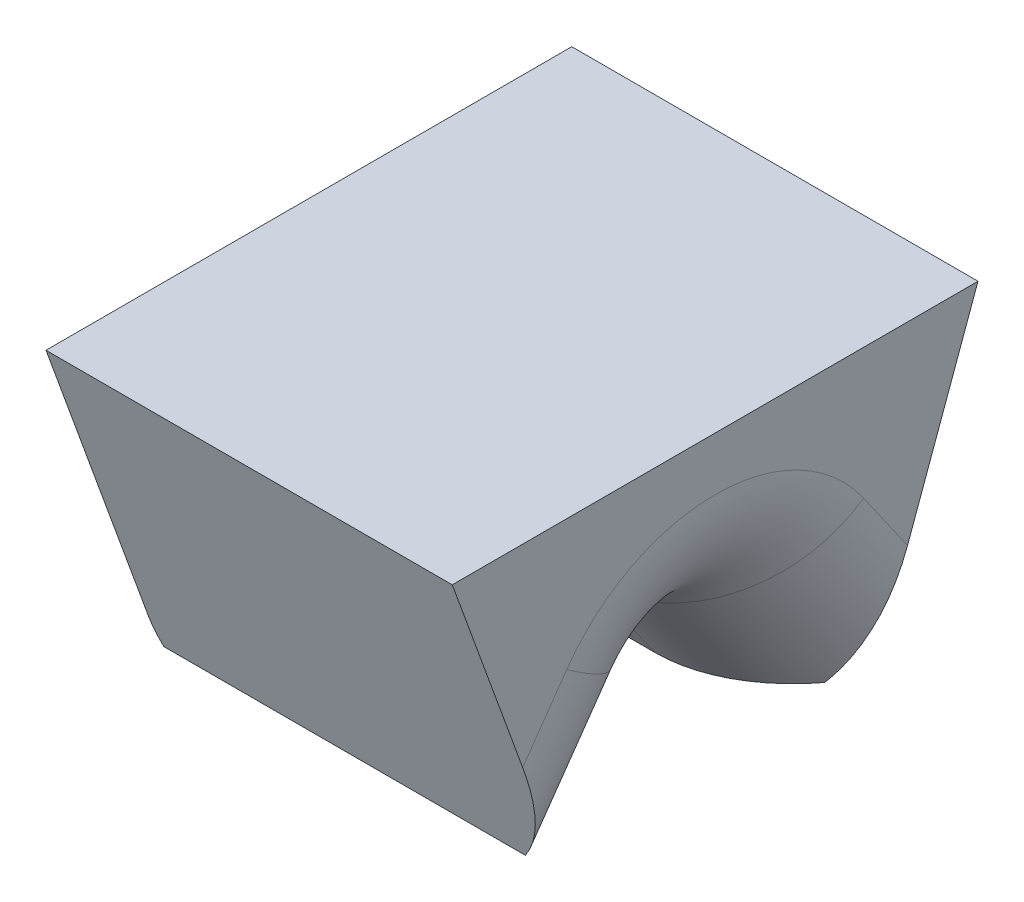
ISO-10303-21;
HEADER;
FILE_DESCRIPTION(('STEP AP214'),'2;1');
FILE_NAME('part.step','',(''),(''),'','','');
FILE_SCHEMA(('AUTOMOTIVE_DESIGN { 1 0 10303 214 1 1 1 1 }'));
ENDSEC;
DATA;
#1=APPLICATION_CONTEXT('core data for automotive mechanical design processes');
#2=APPLICATION_PROTOCOL_DEFINITION('international standard','automotive_design',2000,#1);
#3=PRODUCT_CONTEXT('',#1,'mechanical');
#4=PRODUCT('Part','Part','',(#3));
#5=PRODUCT_RELATED_PRODUCT_CATEGORY('part','',(#4));
#6=PRODUCT_DEFINITION_FORMATION('','',#4);
#7=PRODUCT_DEFINITION_CONTEXT('part definition',#1,'design');
#8=PRODUCT_DEFINITION('design','',#6,#7);
#9=PRODUCT_DEFINITION_SHAPE('','',#8);
#10=(LENGTH_UNIT() NAMED_UNIT(*) SI_UNIT(.MILLI.,.METRE.));
#11=(NAMED_UNIT(*) PLANE_ANGLE_UNIT() SI_UNIT($,.RADIAN.));
#12=(NAMED_UNIT(*) SI_UNIT($,.STERADIAN.) SOLID_ANGLE_UNIT());
#13=UNCERTAINTY_MEASURE_WITH_UNIT(LENGTH_MEASURE(1.E-05),#10,'distance_accuracy_value','');
#14=(GEOMETRIC_REPRESENTATION_CONTEXT(3) GLOBAL_UNCERTAINTY_ASSIGNED_CONTEXT((#13)) GLOBAL_UNIT_ASSIGNED_CONTEXT((#10,
#11,#12)) REPRESENTATION_CONTEXT('',''));
#15=CARTESIAN_POINT('',(0.,0.,0.));
#16=DIRECTION('',(0.,0.,1.));
#17=DIRECTION('',(1.,0.,0.));
#18=AXIS2_PLACEMENT_3D('',#15,#16,#17);
#19=CARTESIAN_POINT('',(0.,0.414017929910338,0.));
#20=DIRECTION('',(0.,1.,0.));
#21=DIRECTION('',(0.,0.,1.));
#22=AXIS2_PLACEMENT_3D('',#19,#20,#21);
#23=PLANE('',#22);
#24=DIRECTION('',(0.,0.,-1.));
#25=VECTOR('',#24,1.);
#26=CARTESIAN_POINT('',(0.50673,0.414017929910338,2.00770998));
#27=LINE('',#26,#25);
#28=CARTESIAN_POINT('',(0.506730000000001,0.414017929910338,0.350080202939874));
#29=VERTEX_POINT('',#28);
#30=CARTESIAN_POINT('',(0.506730000000001,0.414017929910338,-0.350080202939874));
#31=VERTEX_POINT('',#30);
#32=EDGE_CURVE('E317',#29,#31,#27,.T.);
#33=ORIENTED_EDGE('',*,*,#32,.F.);
#34=DIRECTION('',(-1.,0.,0.));
#35=VECTOR('',#34,1.);
#36=CARTESIAN_POINT('',(2.00770998,0.414017929910338,0.350080202939874));
#37=LINE('',#36,#35);
#38=CARTESIAN_POINT('',(1.04775,0.414017929910338,0.350080202939874));
#39=VERTEX_POINT('',#38);
#40=EDGE_CURVE('E57',#39,#29,#37,.T.);
#41=ORIENTED_EDGE('',*,*,#40,.F.);
#42=DIRECTION('',(0.,0.,1.));
#43=VECTOR('',#42,1.);
#44=CARTESIAN_POINT('',(1.04775,0.414017929910338,2.00770998));
#45=LINE('',#44,#43);
#46=CARTESIAN_POINT('',(1.04775,0.414017929910338,-0.350080202939874));
#47=VERTEX_POINT('',#46);
#48=EDGE_CURVE('E12',#47,#39,#45,.T.);
#49=ORIENTED_EDGE('',*,*,#48,.F.);
#50=DIRECTION('',(1.,0.,0.));
#51=VECTOR('',#50,1.);
#52=CARTESIAN_POINT('',(2.00770998,0.414017929910338,-0.350080202939874));
#53=LINE('',#52,#51);
#54=EDGE_CURVE('E129',#31,#47,#53,.T.);
#55=ORIENTED_EDGE('',*,*,#54,.F.);
#56=EDGE_LOOP('',(#33,#41,#49,#55));
#57=FACE_BOUND('',#56,.T.);
#58=ADVANCED_FACE('F42',(#57),#23,.T.);
#59=CARTESIAN_POINT('',(2.00770998,0.,0.19939));
#60=DIRECTION('',(0.,-0.342020143325669,0.939692620785908));
#61=DIRECTION('',(0.,-0.939692620785908,-0.342020143325669));
#62=AXIS2_PLACEMENT_3D('',#59,#60,#61);
#63=PLANE('',#62);
#64=DIRECTION('',(0.,0.939692620785908,0.342020143325669));
#65=VECTOR('',#64,1.);
#66=CARTESIAN_POINT('',(1.04775,0.,0.19939));
#67=LINE('',#66,#65);
#68=CARTESIAN_POINT('',(1.04775,0.156293429962624,0.256276156317765));
#69=VERTEX_POINT('',#68);
#70=EDGE_CURVE('E147',#69,#39,#67,.T.);
#71=ORIENTED_EDGE('',*,*,#70,.T.);
#72=ORIENTED_EDGE('',*,*,#40,.T.);
#73=DIRECTION('',(0.,-0.939692620785908,-0.342020143325669));
#74=VECTOR('',#73,1.);
#75=CARTESIAN_POINT('',(0.50673,0.,0.19939));
#76=LINE('',#75,#74);
#77=CARTESIAN_POINT('',(0.50673,0.0397426980960916,0.213855159136405));
#78=VERTEX_POINT('',#77);
#79=EDGE_CURVE('E161',#29,#78,#76,.T.);
#80=ORIENTED_EDGE('',*,*,#79,.T.);
#81=CARTESIAN_POINT('',(0.60579,0.0397426980960916,0.213855159136405));
#82=DIRECTION('',(0.,-0.342020143325669,0.939692620785908));
#83=DIRECTION('',(0.,-0.939692620785908,-0.342020143325669));
#84=AXIS2_PLACEMENT_3D('',#81,#82,#83);
#85=ELLIPSE('',#84,0.12092993076271,0.09906);
#86=CARTESIAN_POINT('',(0.512985729992794,0.,0.19939));
#87=VERTEX_POINT('',#86);
#88=EDGE_CURVE('E258',#78,#87,#85,.T.);
#89=ORIENTED_EDGE('',*,*,#88,.T.);
#90=DIRECTION('',(-1.,0.,0.));
#91=VECTOR('',#90,1.);
#92=CARTESIAN_POINT('',(2.00770998,0.,0.19939));
#93=LINE('',#92,#91);
#94=CARTESIAN_POINT('',(0.994405422545101,0.,0.19939));
#95=VERTEX_POINT('',#94);
#96=EDGE_CURVE('E163',#95,#87,#93,.T.);
#97=ORIENTED_EDGE('',*,*,#96,.F.);
#98=CARTESIAN_POINT('',(0.84709,0.156293429962624,0.256276156317765));
#99=DIRECTION('',(0.,-0.342020143325669,0.939692620785908));
#100=DIRECTION('',(0.,0.939692620785908,0.342020143325669));
#101=AXIS2_PLACEMENT_3D('',#98,#99,#100);
#102=ELLIPSE('',#101,0.244960628980874,0.20066);
#103=EDGE_CURVE('E311',#95,#69,#102,.T.);
#104=ORIENTED_EDGE('',*,*,#103,.T.);
#105=EDGE_LOOP('',(#71,#72,#80,#89,#97,#104));
#106=FACE_BOUND('',#105,.T.);
#107=ADVANCED_FACE('F214',(#106),#63,.T.);
#108=CARTESIAN_POINT('',(2.00770998,0.,-0.19939));
#109=DIRECTION('',(0.,-0.342020143325669,-0.939692620785908));
#110=DIRECTION('',(0.,0.939692620785908,-0.342020143325669));
#111=AXIS2_PLACEMENT_3D('',#108,#109,#110);
#112=PLANE('',#111);
#113=DIRECTION('',(0.,0.939692620785908,-0.342020143325669));
#114=VECTOR('',#113,1.);
#115=CARTESIAN_POINT('',(0.50673,0.,-0.19939));
#116=LINE('',#115,#114);
#117=CARTESIAN_POINT('',(0.50673,0.0397426980960916,-0.213855159136405));
#118=VERTEX_POINT('',#117);
#119=EDGE_CURVE('E141',#118,#31,#116,.T.);
#120=ORIENTED_EDGE('',*,*,#119,.T.);
#121=ORIENTED_EDGE('',*,*,#54,.T.);
#122=DIRECTION('',(0.,-0.939692620785908,0.342020143325669));
#123=VECTOR('',#122,1.);
#124=CARTESIAN_POINT('',(1.04775,0.,-0.19939));
#125=LINE('',#124,#123);
#126=CARTESIAN_POINT('',(1.04775,0.156293429962624,-0.256276156317765));
#127=VERTEX_POINT('',#126);
#128=EDGE_CURVE('E138',#47,#127,#125,.T.);
#129=ORIENTED_EDGE('',*,*,#128,.T.);
#130=CARTESIAN_POINT('',(0.84709,0.156293429962624,-0.256276156317765));
#131=DIRECTION('',(0.,-0.342020143325669,-0.939692620785908));
#132=DIRECTION('',(0.,-0.939692620785908,0.342020143325669));
#133=AXIS2_PLACEMENT_3D('',#130,#131,#132);
#134=ELLIPSE('',#133,0.244960628980874,0.20066);
#135=CARTESIAN_POINT('',(0.994405422545101,0.,-0.19939));
#136=VERTEX_POINT('',#135);
#137=EDGE_CURVE('E300',#127,#136,#134,.T.);
#138=ORIENTED_EDGE('',*,*,#137,.T.);
#139=DIRECTION('',(-1.,0.,0.));
#140=VECTOR('',#139,1.);
#141=CARTESIAN_POINT('',(2.00770998,0.,-0.19939));
#142=LINE('',#141,#140);
#143=CARTESIAN_POINT('',(0.512985729992795,0.,-0.19939));
#144=VERTEX_POINT('',#143);
#145=EDGE_CURVE('E165',#136,#144,#142,.T.);
#146=ORIENTED_EDGE('',*,*,#145,.T.);
#147=CARTESIAN_POINT('',(0.60579,0.0397426980960917,-0.213855159136405));
#148=DIRECTION('',(0.,-0.342020143325669,-0.939692620785908));
#149=DIRECTION('',(0.,0.939692620785908,-0.342020143325669));
#150=AXIS2_PLACEMENT_3D('',#147,#148,#149);
#151=ELLIPSE('',#150,0.12092993076271,0.09906);
#152=EDGE_CURVE('E275',#144,#118,#151,.T.);
#153=ORIENTED_EDGE('',*,*,#152,.T.);
#154=EDGE_LOOP('',(#120,#121,#129,#138,#146,#153));
#155=FACE_BOUND('',#154,.T.);
#156=ADVANCED_FACE('F137',(#155),#112,.T.);
#157=CARTESIAN_POINT('',(0.50673,0.77994002,2.00770998));
#158=DIRECTION('',(-1.,0.,0.));
#159=DIRECTION('',(0.,-1.,0.));
#160=AXIS2_PLACEMENT_3D('',#157,#158,#159);
#161=PLANE('',#160);
#162=ORIENTED_EDGE('',*,*,#79,.F.);
#163=ORIENTED_EDGE('',*,*,#32,.T.);
#164=ORIENTED_EDGE('',*,*,#119,.F.);
#165=DIRECTION('',(0.,-0.819152044288992,-0.573576436351045));
#166=VECTOR('',#165,1.);
#167=CARTESIAN_POINT('',(0.50673,0.181728628158241,-0.114435540587172));
#168=LINE('',#167,#166);
#169=CARTESIAN_POINT('',(0.50673,0.181728628158241,-0.114435540587172));
#170=VERTEX_POINT('',#169);
#171=EDGE_CURVE('E248',#118,#170,#168,.F.);
#172=ORIENTED_EDGE('',*,*,#171,.T.);
#173=CARTESIAN_POINT('',(0.50673,0.1016,0.));
#174=DIRECTION('',(-1.,0.,0.));
#175=DIRECTION('',(0.,-1.,0.));
#176=AXIS2_PLACEMENT_3D('',#173,#174,#175);
#177=CIRCLE('',#176,0.1397);
#178=CARTESIAN_POINT('',(0.50673,0.181728628158241,0.114435540587172));
#179=VERTEX_POINT('',#178);
#180=EDGE_CURVE('E253',#170,#179,#177,.F.);
#181=ORIENTED_EDGE('',*,*,#180,.T.);
#182=DIRECTION('',(0.,0.819152044288993,-0.573576436351045));
#183=VECTOR('',#182,1.);
#184=CARTESIAN_POINT('',(0.50673,0.0568184817849346,0.201898566676639));
#185=LINE('',#184,#183);
#186=EDGE_CURVE('E255',#179,#78,#185,.F.);
#187=ORIENTED_EDGE('',*,*,#186,.T.);
#188=EDGE_LOOP('',(#162,#163,#164,#172,#181,#187));
#189=FACE_BOUND('',#188,.T.);
#190=ADVANCED_FACE('F338',(#189),#161,.T.);
#191=CARTESIAN_POINT('',(1.04775,-0.00999998,2.00770998));
#192=DIRECTION('',(1.,0.,0.));
#193=DIRECTION('',(0.,0.,-1.));
#194=AXIS2_PLACEMENT_3D('',#191,#192,#193);
#195=PLANE('',#194);
#196=ORIENTED_EDGE('',*,*,#128,.F.);
#197=ORIENTED_EDGE('',*,*,#48,.T.);
#198=ORIENTED_EDGE('',*,*,#70,.F.);
#199=DIRECTION('',(0.,-0.819152044288993,0.573576436351045));
#200=VECTOR('',#199,1.);
#201=CARTESIAN_POINT('',(1.04775,0.240003994091507,0.197661388286934));
#202=LINE('',#201,#200);
#203=CARTESIAN_POINT('',(1.04775,0.240003994091507,0.197661388286934));
#204=VERTEX_POINT('',#203);
#205=EDGE_CURVE('E297',#69,#204,#202,.F.);
#206=ORIENTED_EDGE('',*,*,#205,.T.);
#207=CARTESIAN_POINT('',(1.04775,0.1016,0.));
#208=DIRECTION('',(1.,0.,0.));
#209=DIRECTION('',(0.,0.,-1.));
#210=AXIS2_PLACEMENT_3D('',#207,#208,#209);
#211=CIRCLE('',#210,0.2413);
#212=CARTESIAN_POINT('',(1.04775,0.240003994091507,-0.197661388286934));
#213=VERTEX_POINT('',#212);
#214=EDGE_CURVE('E293',#204,#213,#211,.F.);
#215=ORIENTED_EDGE('',*,*,#214,.T.);
#216=DIRECTION('',(0.,0.819152044288992,0.573576436351045));
#217=VECTOR('',#216,1.);
#218=CARTESIAN_POINT('',(1.04775,0.115093847718201,-0.285124414376401));
#219=LINE('',#218,#217);
#220=EDGE_CURVE('E145',#213,#127,#219,.F.);
#221=ORIENTED_EDGE('',*,*,#220,.T.);
#222=EDGE_LOOP('',(#196,#197,#198,#206,#215,#221));
#223=FACE_BOUND('',#222,.T.);
#224=ADVANCED_FACE('F143',(#223),#195,.T.);
#225=CARTESIAN_POINT('',(0.,0.,0.));
#226=DIRECTION('',(0.,1.,0.));
#227=DIRECTION('',(0.,0.,1.));
#228=AXIS2_PLACEMENT_3D('',#225,#226,#227);
#229=PLANE('',#228);
#230=ORIENTED_EDGE('',*,*,#145,.F.);
#231=CARTESIAN_POINT('',(0.84709,0.,-0.365713994150245));
#232=DIRECTION('',(0.,1.,0.));
#233=DIRECTION('',(0.,0.,-1.));
#234=AXIS2_PLACEMENT_3D('',#231,#232,#233);
#235=ELLIPSE('',#234,0.244960628980874,0.20066);
#236=CARTESIAN_POINT('',(0.84709,0.,-0.120753365169372));
#237=VERTEX_POINT('',#236);
#238=EDGE_CURVE('E302',#136,#237,#235,.F.);
#239=ORIENTED_EDGE('',*,*,#238,.T.);
#240=CARTESIAN_POINT('',(0.84709,0.,-0.120753365169372));
#241=DIRECTION('',(-1.,0.,0.));
#242=VECTOR('',#241,1.);
#243=LINE('',#240,#242);
#244=CARTESIAN_POINT('',(0.60579,0.,-0.120753365169372));
#245=VERTEX_POINT('',#244);
#246=EDGE_CURVE('E249',#237,#245,#243,.T.);
#247=ORIENTED_EDGE('',*,*,#246,.T.);
#248=CARTESIAN_POINT('',(0.60579,0.,-0.241683295932081));
#249=DIRECTION('',(0.,1.,0.));
#250=DIRECTION('',(0.,0.,1.));
#251=AXIS2_PLACEMENT_3D('',#248,#249,#250);
#252=ELLIPSE('',#251,0.12092993076271,0.09906);
#253=EDGE_CURVE('E270',#245,#144,#252,.F.);
#254=ORIENTED_EDGE('',*,*,#253,.T.);
#255=EDGE_LOOP('',(#230,#239,#247,#254));
#256=FACE_BOUND('',#255,.T.);
#257=ADVANCED_FACE('F186',(#256),#229,.F.);
#258=CARTESIAN_POINT('',(0.60579,0.,0.120753365169372));
#259=DIRECTION('',(1.,0.,0.));
#260=VECTOR('',#259,1.);
#261=LINE('',#258,#260);
#262=CARTESIAN_POINT('',(0.60579,0.,0.120753365169372));
#263=VERTEX_POINT('',#262);
#264=CARTESIAN_POINT('',(0.84709,0.,0.120753365169372));
#265=VERTEX_POINT('',#264);
#266=EDGE_CURVE('E167',#263,#265,#261,.T.);
#267=ORIENTED_EDGE('',*,*,#266,.T.);
#268=CARTESIAN_POINT('',(0.84709,0.,0.365713994150245));
#269=DIRECTION('',(0.,1.,0.));
#270=DIRECTION('',(0.,0.,-1.));
#271=AXIS2_PLACEMENT_3D('',#268,#269,#270);
#272=ELLIPSE('',#271,0.244960628980874,0.20066);
#273=EDGE_CURVE('E64',#265,#95,#272,.F.);
#274=ORIENTED_EDGE('',*,*,#273,.T.);
#275=ORIENTED_EDGE('',*,*,#96,.T.);
#276=CARTESIAN_POINT('',(0.60579,0.,0.241683295932081));
#277=DIRECTION('',(0.,1.,0.));
#278=DIRECTION('',(0.,0.,1.));
#279=AXIS2_PLACEMENT_3D('',#276,#277,#278);
#280=ELLIPSE('',#279,0.12092993076271,0.09906);
#281=EDGE_CURVE('E261',#87,#263,#280,.F.);
#282=ORIENTED_EDGE('',*,*,#281,.T.);
#283=EDGE_LOOP('',(#267,#274,#275,#282));
#284=FACE_BOUND('',#283,.T.);
#285=ADVANCED_FACE('F175',(#284),#229,.F.);
#286=CARTESIAN_POINT('',(-1.60147,0.124910146373306,-0.0332903390799046));
#287=DIRECTION('',(0.,0.573576436351045,-0.819152044288992));
#288=DIRECTION('',(0.,0.819152044288992,0.573576436351045));
#289=AXIS2_PLACEMENT_3D('',#286,#287,#288);
#290=PLANE('',#289);
#291=ORIENTED_EDGE('',*,*,#246,.F.);
#292=DIRECTION('',(0.,0.819152044288992,0.573576436351045));
#293=VECTOR('',#292,1.);
#294=CARTESIAN_POINT('',(0.84709,0.124910146373306,-0.0332903390799046));
#295=LINE('',#294,#293);
#296=CARTESIAN_POINT('',(0.84709,0.124910146373306,-0.0332903390799046));
#297=VERTEX_POINT('',#296);
#298=EDGE_CURVE('E279',#237,#297,#295,.T.);
#299=ORIENTED_EDGE('',*,*,#298,.T.);
#300=DIRECTION('',(1.,0.,0.));
#301=VECTOR('',#300,1.);
#302=CARTESIAN_POINT('',(-1.60147,0.124910146373306,-0.0332903390799046));
#303=LINE('',#302,#301);
#304=CARTESIAN_POINT('',(0.60579,0.124910146373306,-0.0332903390799046));
#305=VERTEX_POINT('',#304);
#306=EDGE_CURVE('E152',#305,#297,#303,.T.);
#307=ORIENTED_EDGE('',*,*,#306,.F.);
#308=DIRECTION('',(0.,-0.819152044288992,-0.573576436351045));
#309=VECTOR('',#308,1.);
#310=CARTESIAN_POINT('',(0.60579,0.,-0.120753365169372));
#311=LINE('',#310,#309);
#312=EDGE_CURVE('E267',#305,#245,#311,.T.);
#313=ORIENTED_EDGE('',*,*,#312,.T.);
#314=EDGE_LOOP('',(#291,#299,#307,#313));
#315=FACE_BOUND('',#314,.T.);
#316=ADVANCED_FACE('F185',(#315),#290,.F.);
#317=CARTESIAN_POINT('',(-1.60147,-0.00999998000000012,0.127755426547318));
#318=DIRECTION('',(0.,0.573576436351045,0.819152044288992));
#319=DIRECTION('',(0.,-0.819152044288993,0.573576436351045));
#320=AXIS2_PLACEMENT_3D('',#317,#318,#319);
#321=PLANE('',#320);
#322=DIRECTION('',(1.,0.,0.));
#323=VECTOR('',#322,1.);
#324=CARTESIAN_POINT('',(-1.60147,0.124910146373306,0.0332903390799046));
#325=LINE('',#324,#323);
#326=CARTESIAN_POINT('',(0.60579,0.124910146373306,0.0332903390799046));
#327=VERTEX_POINT('',#326);
#328=CARTESIAN_POINT('',(0.84709,0.124910146373306,0.0332903390799046));
#329=VERTEX_POINT('',#328);
#330=EDGE_CURVE('E148',#327,#329,#325,.T.);
#331=ORIENTED_EDGE('',*,*,#330,.T.);
#332=DIRECTION('',(0.,-0.819152044288993,0.573576436351045));
#333=VECTOR('',#332,1.);
#334=CARTESIAN_POINT('',(0.84709,0.,0.120753365169372));
#335=LINE('',#334,#333);
#336=EDGE_CURVE('E304',#329,#265,#335,.T.);
#337=ORIENTED_EDGE('',*,*,#336,.T.);
#338=ORIENTED_EDGE('',*,*,#266,.F.);
#339=DIRECTION('',(0.,0.819152044288993,-0.573576436351045));
#340=VECTOR('',#339,1.);
#341=CARTESIAN_POINT('',(0.60579,0.124910146373306,0.0332903390799045));
#342=LINE('',#341,#340);
#343=EDGE_CURVE('E246',#263,#327,#342,.T.);
#344=ORIENTED_EDGE('',*,*,#343,.T.);
#345=EDGE_LOOP('',(#331,#337,#338,#344));
#346=FACE_BOUND('',#345,.T.);
#347=ADVANCED_FACE('F223',(#346),#321,.F.);
#348=CARTESIAN_POINT('',(-1.60147,0.1016,0.));
#349=DIRECTION('',(1.,0.,0.));
#350=DIRECTION('',(0.,0.,-1.));
#351=AXIS2_PLACEMENT_3D('',#348,#349,#350);
#352=CYLINDRICAL_SURFACE('',#351,0.0406399999999999);
#353=ORIENTED_EDGE('',*,*,#306,.T.);
#354=CARTESIAN_POINT('',(0.84709,0.1016,0.));
#355=DIRECTION('',(1.,0.,0.));
#356=DIRECTION('',(0.,0.,-1.));
#357=AXIS2_PLACEMENT_3D('',#354,#355,#356);
#358=CIRCLE('',#357,0.0406399999999999);
#359=EDGE_CURVE('E50',#297,#329,#358,.T.);
#360=ORIENTED_EDGE('',*,*,#359,.T.);
#361=ORIENTED_EDGE('',*,*,#330,.F.);
#362=CARTESIAN_POINT('',(0.60579,0.1016,0.));
#363=DIRECTION('',(-1.,0.,0.));
#364=DIRECTION('',(0.,-1.,0.));
#365=AXIS2_PLACEMENT_3D('',#362,#363,#364);
#366=CIRCLE('',#365,0.0406399999999999);
#367=EDGE_CURVE('E263',#327,#305,#366,.T.);
#368=ORIENTED_EDGE('',*,*,#367,.T.);
#369=EDGE_LOOP('',(#353,#360,#361,#368));
#370=FACE_BOUND('',#369,.T.);
#371=ADVANCED_FACE('F200',(#370),#352,.F.);
#372=CARTESIAN_POINT('',(0.60579,0.181728628158241,-0.114435540587172));
#373=DIRECTION('',(0.,0.819152044288992,0.573576436351045));
#374=DIRECTION('',(0.,-0.573576436351045,0.819152044288992));
#375=AXIS2_PLACEMENT_3D('',#372,#373,#374);
#376=CYLINDRICAL_SURFACE('',#375,0.09906);
#377=ORIENTED_EDGE('',*,*,#253,.F.);
#378=ORIENTED_EDGE('',*,*,#312,.F.);
#379=CARTESIAN_POINT('',(0.60579,0.181728628158241,-0.114435540587172));
#380=DIRECTION('',(0.,0.819152044288993,0.573576436351044));
#381=DIRECTION('',(0.,-0.573576436351044,0.819152044288993));
#382=AXIS2_PLACEMENT_3D('',#379,#380,#381);
#383=CIRCLE('',#382,0.09906);
#384=EDGE_CURVE('E282',#170,#305,#383,.T.);
#385=ORIENTED_EDGE('',*,*,#384,.F.);
#386=ORIENTED_EDGE('',*,*,#171,.F.);
#387=ORIENTED_EDGE('',*,*,#152,.F.);
#388=EDGE_LOOP('',(#377,#378,#385,#386,#387));
#389=FACE_BOUND('',#388,.T.);
#390=ADVANCED_FACE('F196',(#389),#376,.T.);
#391=CARTESIAN_POINT('',(0.60579,0.1016,0.));
#392=DIRECTION('',(-1.,0.,0.));
#393=DIRECTION('',(0.,-1.,0.));
#394=AXIS2_PLACEMENT_3D('',#391,#392,#393);
#395=TOROIDAL_SURFACE('',#394,0.1397,0.09906);
#396=ORIENTED_EDGE('',*,*,#384,.T.);
#397=ORIENTED_EDGE('',*,*,#367,.F.);
#398=CARTESIAN_POINT('',(0.60579,0.181728628158241,0.114435540587172));
#399=DIRECTION('',(0.,-0.819152044288992,0.573576436351045));
#400=DIRECTION('',(0.,-0.573576436351045,-0.819152044288992));
#401=AXIS2_PLACEMENT_3D('',#398,#399,#400);
#402=CIRCLE('',#401,0.09906);
#403=EDGE_CURVE('E280',#179,#327,#402,.T.);
#404=ORIENTED_EDGE('',*,*,#403,.F.);
#405=ORIENTED_EDGE('',*,*,#180,.F.);
#406=EDGE_LOOP('',(#396,#397,#404,#405));
#407=FACE_BOUND('',#406,.T.);
#408=ADVANCED_FACE('F192',(#407),#395,.T.);
#409=CARTESIAN_POINT('',(0.60579,0.0468185017849346,0.208900628054586));
#410=DIRECTION('',(0.,-0.819152044288993,0.573576436351045));
#411=DIRECTION('',(0.,-0.573576436351045,-0.819152044288992));
#412=AXIS2_PLACEMENT_3D('',#409,#410,#411);
#413=CYLINDRICAL_SURFACE('',#412,0.09906);
#414=ORIENTED_EDGE('',*,*,#88,.F.);
#415=ORIENTED_EDGE('',*,*,#186,.F.);
#416=ORIENTED_EDGE('',*,*,#403,.T.);
#417=ORIENTED_EDGE('',*,*,#343,.F.);
#418=ORIENTED_EDGE('',*,*,#281,.F.);
#419=EDGE_LOOP('',(#414,#415,#416,#417,#418));
#420=FACE_BOUND('',#419,.T.);
#421=ADVANCED_FACE('F188',(#420),#413,.T.);
#422=CARTESIAN_POINT('',(0.84709,0.105093867718201,0.292126475754347));
#423=DIRECTION('',(0.,0.819152044288993,-0.573576436351045));
#424=DIRECTION('',(0.,0.573576436351045,0.819152044288992));
#425=AXIS2_PLACEMENT_3D('',#422,#423,#424);
#426=CYLINDRICAL_SURFACE('',#425,0.20066);
#427=ORIENTED_EDGE('',*,*,#273,.F.);
#428=ORIENTED_EDGE('',*,*,#336,.F.);
#429=CARTESIAN_POINT('',(0.84709,0.240003994091507,0.197661388286934));
#430=DIRECTION('',(0.,0.819152044288992,-0.573576436351045));
#431=DIRECTION('',(0.,0.573576436351045,0.819152044288992));
#432=AXIS2_PLACEMENT_3D('',#429,#430,#431);
#433=CIRCLE('',#432,0.20066);
#434=EDGE_CURVE('E283',#204,#329,#433,.T.);
#435=ORIENTED_EDGE('',*,*,#434,.F.);
#436=ORIENTED_EDGE('',*,*,#205,.F.);
#437=ORIENTED_EDGE('',*,*,#103,.F.);
#438=EDGE_LOOP('',(#427,#428,#435,#436,#437));
#439=FACE_BOUND('',#438,.T.);
#440=ADVANCED_FACE('F44',(#439),#426,.T.);
#441=CARTESIAN_POINT('',(0.84709,0.1016,0.));
#442=DIRECTION('',(1.,0.,0.));
#443=DIRECTION('',(0.,0.,-1.));
#444=AXIS2_PLACEMENT_3D('',#441,#442,#443);
#445=TOROIDAL_SURFACE('',#444,0.2413,0.20066);
#446=ORIENTED_EDGE('',*,*,#434,.T.);
#447=ORIENTED_EDGE('',*,*,#359,.F.);
#448=CARTESIAN_POINT('',(0.84709,0.240003994091507,-0.197661388286934));
#449=DIRECTION('',(0.,-0.819152044288992,-0.573576436351045));
#450=DIRECTION('',(0.,0.573576436351045,-0.819152044288992));
#451=AXIS2_PLACEMENT_3D('',#448,#449,#450);
#452=CIRCLE('',#451,0.20066);
#453=EDGE_CURVE('E316',#213,#297,#452,.T.);
#454=ORIENTED_EDGE('',*,*,#453,.F.);
#455=ORIENTED_EDGE('',*,*,#214,.F.);
#456=EDGE_LOOP('',(#446,#447,#454,#455));
#457=FACE_BOUND('',#456,.T.);
#458=ADVANCED_FACE('F204',(#457),#445,.T.);
#459=CARTESIAN_POINT('',(0.84709,0.240003994091507,-0.197661388286934));
#460=DIRECTION('',(0.,-0.819152044288992,-0.573576436351045));
#461=DIRECTION('',(0.,0.573576436351045,-0.819152044288992));
#462=AXIS2_PLACEMENT_3D('',#459,#460,#461);
#463=CYLINDRICAL_SURFACE('',#462,0.20066);
#464=ORIENTED_EDGE('',*,*,#137,.F.);
#465=ORIENTED_EDGE('',*,*,#220,.F.);
#466=ORIENTED_EDGE('',*,*,#453,.T.);
#467=ORIENTED_EDGE('',*,*,#298,.F.);
#468=ORIENTED_EDGE('',*,*,#238,.F.);
#469=EDGE_LOOP('',(#464,#465,#466,#467,#468));
#470=FACE_BOUND('',#469,.T.);
#471=ADVANCED_FACE('F202',(#470),#463,.T.);
#472=CLOSED_SHELL('',(#58,#107,#156,#190,#224,#257,#285,#316,#347,#371,#390,#408,#421,#440,#458,#471));
#473=MANIFOLD_SOLID_BREP('B2',#472);
#474=ADVANCED_BREP_SHAPE_REPRESENTATION('',(#18,#473),#14);
#475=SHAPE_DEFINITION_REPRESENTATION(#9,#474);
ENDSEC;
END-ISO-10303-21;
